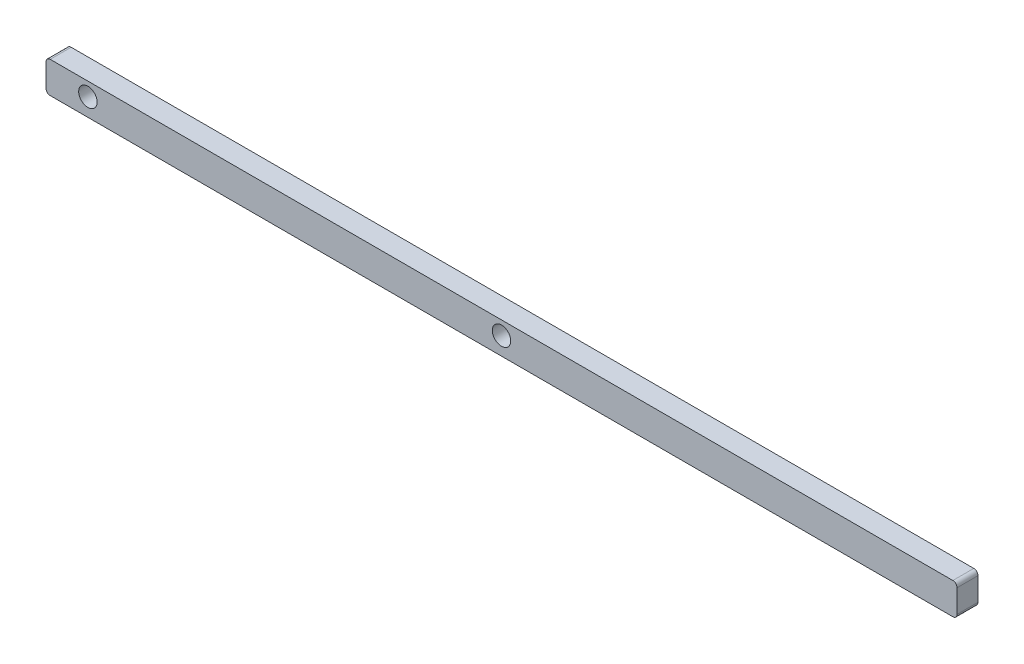
ISO-10303-21;
HEADER;
FILE_DESCRIPTION(('STEP AP214'),'2;1');
FILE_NAME('part.step','',(''),(''),'','','');
FILE_SCHEMA(('AUTOMOTIVE_DESIGN { 1 0 10303 214 1 1 1 1 }'));
ENDSEC;
DATA;
#1=APPLICATION_CONTEXT('core data for automotive mechanical design processes');
#2=APPLICATION_PROTOCOL_DEFINITION('international standard','automotive_design',2000,#1);
#3=PRODUCT_CONTEXT('',#1,'mechanical');
#4=PRODUCT('Part','Part','',(#3));
#5=PRODUCT_RELATED_PRODUCT_CATEGORY('part','',(#4));
#6=PRODUCT_DEFINITION_FORMATION('','',#4);
#7=PRODUCT_DEFINITION_CONTEXT('part definition',#1,'design');
#8=PRODUCT_DEFINITION('design','',#6,#7);
#9=PRODUCT_DEFINITION_SHAPE('','',#8);
#10=(LENGTH_UNIT() NAMED_UNIT(*) SI_UNIT(.MILLI.,.METRE.));
#11=(NAMED_UNIT(*) PLANE_ANGLE_UNIT() SI_UNIT($,.RADIAN.));
#12=(NAMED_UNIT(*) SI_UNIT($,.STERADIAN.) SOLID_ANGLE_UNIT());
#13=UNCERTAINTY_MEASURE_WITH_UNIT(LENGTH_MEASURE(1.E-05),#10,'distance_accuracy_value','');
#14=(GEOMETRIC_REPRESENTATION_CONTEXT(3) GLOBAL_UNCERTAINTY_ASSIGNED_CONTEXT((#13)) GLOBAL_UNIT_ASSIGNED_CONTEXT((#10,
#11,#12)) REPRESENTATION_CONTEXT('',''));
#15=CARTESIAN_POINT('',(0.,0.,0.));
#16=DIRECTION('',(0.,0.,1.));
#17=DIRECTION('',(1.,0.,0.));
#18=AXIS2_PLACEMENT_3D('',#15,#16,#17);
#19=CARTESIAN_POINT('',(0.,0.,6.35));
#20=DIRECTION('',(0.,0.,-1.));
#21=DIRECTION('',(-1.,0.,0.));
#22=AXIS2_PLACEMENT_3D('',#19,#20,#21);
#23=PLANE('',#22);
#24=DIRECTION('',(-1.,0.,0.));
#25=VECTOR('',#24,1.);
#26=CARTESIAN_POINT('',(-276.225,8.26714086578759,6.35));
#27=LINE('',#26,#25);
#28=CARTESIAN_POINT('',(273.685,8.26714086578759,6.35));
#29=VERTEX_POINT('',#28);
#30=CARTESIAN_POINT('',(-273.685,8.26714086578759,6.35));
#31=VERTEX_POINT('',#30);
#32=EDGE_CURVE('E194',#29,#31,#27,.T.);
#33=ORIENTED_EDGE('',*,*,#32,.T.);
#34=CARTESIAN_POINT('',(-273.685,5.72714086578759,6.35));
#35=DIRECTION('',(0.,0.,-1.));
#36=DIRECTION('',(-1.,0.,0.));
#37=AXIS2_PLACEMENT_3D('',#34,#35,#36);
#38=CIRCLE('',#37,2.54);
#39=CARTESIAN_POINT('',(-276.225,5.72714086578758,6.35));
#40=VERTEX_POINT('',#39);
#41=EDGE_CURVE('E170',#31,#40,#38,.F.);
#42=ORIENTED_EDGE('',*,*,#41,.T.);
#43=DIRECTION('',(0.,-1.,0.));
#44=VECTOR('',#43,1.);
#45=CARTESIAN_POINT('',(-276.225,-10.7828591342124,6.35));
#46=LINE('',#45,#44);
#47=CARTESIAN_POINT('',(-276.225,-8.24285913421241,6.35));
#48=VERTEX_POINT('',#47);
#49=EDGE_CURVE('E127',#40,#48,#46,.T.);
#50=ORIENTED_EDGE('',*,*,#49,.T.);
#51=CARTESIAN_POINT('',(-273.685,-8.24285913421241,6.35));
#52=DIRECTION('',(0.,0.,-1.));
#53=DIRECTION('',(-1.,0.,0.));
#54=AXIS2_PLACEMENT_3D('',#51,#52,#53);
#55=CIRCLE('',#54,2.54);
#56=CARTESIAN_POINT('',(-273.685,-10.7828591342124,6.35));
#57=VERTEX_POINT('',#56);
#58=EDGE_CURVE('E62',#48,#57,#55,.F.);
#59=ORIENTED_EDGE('',*,*,#58,.T.);
#60=DIRECTION('',(1.,0.,0.));
#61=VECTOR('',#60,1.);
#62=CARTESIAN_POINT('',(-276.225,-10.7828591342124,6.35));
#63=LINE('',#62,#61);
#64=CARTESIAN_POINT('',(273.685,-10.7828591342124,6.35));
#65=VERTEX_POINT('',#64);
#66=EDGE_CURVE('E148',#57,#65,#63,.T.);
#67=ORIENTED_EDGE('',*,*,#66,.T.);
#68=CARTESIAN_POINT('',(273.685,-8.24285913421241,6.35));
#69=DIRECTION('',(0.,0.,-1.));
#70=DIRECTION('',(-1.,0.,0.));
#71=AXIS2_PLACEMENT_3D('',#68,#69,#70);
#72=CIRCLE('',#71,2.54);
#73=CARTESIAN_POINT('',(276.225,-8.24285913421241,6.35));
#74=VERTEX_POINT('',#73);
#75=EDGE_CURVE('E165',#65,#74,#72,.F.);
#76=ORIENTED_EDGE('',*,*,#75,.T.);
#77=DIRECTION('',(0.,1.,0.));
#78=VECTOR('',#77,1.);
#79=CARTESIAN_POINT('',(276.225,-10.7828591342124,6.35));
#80=LINE('',#79,#78);
#81=CARTESIAN_POINT('',(276.225,5.72714086578758,6.35));
#82=VERTEX_POINT('',#81);
#83=EDGE_CURVE('E141',#74,#82,#80,.T.);
#84=ORIENTED_EDGE('',*,*,#83,.T.);
#85=CARTESIAN_POINT('',(273.685,5.72714086578759,6.35));
#86=DIRECTION('',(0.,0.,-1.));
#87=DIRECTION('',(-1.,0.,0.));
#88=AXIS2_PLACEMENT_3D('',#85,#86,#87);
#89=CIRCLE('',#88,2.54);
#90=EDGE_CURVE('E162',#82,#29,#89,.F.);
#91=ORIENTED_EDGE('',*,*,#90,.T.);
#92=EDGE_LOOP('',(#33,#42,#50,#59,#67,#76,#84,#91));
#93=FACE_BOUND('',#92,.T.);
#94=CARTESIAN_POINT('',(0.,0.,6.35));
#95=DIRECTION('',(0.,0.,1.));
#96=DIRECTION('',(1.,0.,0.));
#97=AXIS2_PLACEMENT_3D('',#94,#95,#96);
#98=CIRCLE('',#97,5.588);
#99=CARTESIAN_POINT('',(5.588,0.,6.35));
#100=VERTEX_POINT('',#99);
#101=EDGE_CURVE('E200',#100,#100,#98,.T.);
#102=ORIENTED_EDGE('',*,*,#101,.F.);
#103=EDGE_LOOP('',(#102));
#104=FACE_BOUND('',#103,.T.);
#105=CARTESIAN_POINT('',(-250.825,0.,6.35));
#106=DIRECTION('',(0.,0.,1.));
#107=DIRECTION('',(1.,0.,0.));
#108=AXIS2_PLACEMENT_3D('',#105,#106,#107);
#109=CIRCLE('',#108,5.58800000000002);
#110=CARTESIAN_POINT('',(-245.237,0.,6.35));
#111=VERTEX_POINT('',#110);
#112=EDGE_CURVE('E214',#111,#111,#109,.T.);
#113=ORIENTED_EDGE('',*,*,#112,.F.);
#114=EDGE_LOOP('',(#113));
#115=FACE_BOUND('',#114,.T.);
#116=ADVANCED_FACE('F39',(#93,#104,#115),#23,.F.);
#117=CARTESIAN_POINT('',(0.,0.,-6.35));
#118=DIRECTION('',(0.,0.,-1.));
#119=DIRECTION('',(-1.,0.,0.));
#120=AXIS2_PLACEMENT_3D('',#117,#118,#119);
#121=PLANE('',#120);
#122=CARTESIAN_POINT('',(0.,0.,-6.35));
#123=DIRECTION('',(0.,0.,1.));
#124=DIRECTION('',(1.,0.,0.));
#125=AXIS2_PLACEMENT_3D('',#122,#123,#124);
#126=CIRCLE('',#125,5.588);
#127=CARTESIAN_POINT('',(5.588,0.,-6.35));
#128=VERTEX_POINT('',#127);
#129=EDGE_CURVE('E203',#128,#128,#126,.T.);
#130=ORIENTED_EDGE('',*,*,#129,.T.);
#131=EDGE_LOOP('',(#130));
#132=FACE_BOUND('',#131,.T.);
#133=DIRECTION('',(0.,-1.,0.));
#134=VECTOR('',#133,1.);
#135=CARTESIAN_POINT('',(-276.225,-10.7828591342124,-6.35));
#136=LINE('',#135,#134);
#137=CARTESIAN_POINT('',(-276.225,5.72714086578758,-6.35));
#138=VERTEX_POINT('',#137);
#139=CARTESIAN_POINT('',(-276.225,-8.24285913421241,-6.35));
#140=VERTEX_POINT('',#139);
#141=EDGE_CURVE('E125',#138,#140,#136,.T.);
#142=ORIENTED_EDGE('',*,*,#141,.F.);
#143=CARTESIAN_POINT('',(-273.685,5.72714086578759,-6.35));
#144=DIRECTION('',(0.,0.,-1.));
#145=DIRECTION('',(-1.,0.,0.));
#146=AXIS2_PLACEMENT_3D('',#143,#144,#145);
#147=CIRCLE('',#146,2.54);
#148=CARTESIAN_POINT('',(-273.685,8.26714086578759,-6.35));
#149=VERTEX_POINT('',#148);
#150=EDGE_CURVE('E107',#138,#149,#147,.T.);
#151=ORIENTED_EDGE('',*,*,#150,.T.);
#152=DIRECTION('',(-1.,0.,0.));
#153=VECTOR('',#152,1.);
#154=CARTESIAN_POINT('',(-276.225,8.26714086578759,-6.35));
#155=LINE('',#154,#153);
#156=CARTESIAN_POINT('',(273.685,8.26714086578759,-6.35));
#157=VERTEX_POINT('',#156);
#158=EDGE_CURVE('E137',#157,#149,#155,.T.);
#159=ORIENTED_EDGE('',*,*,#158,.F.);
#160=CARTESIAN_POINT('',(273.685,5.72714086578759,-6.35));
#161=DIRECTION('',(0.,0.,-1.));
#162=DIRECTION('',(-1.,0.,0.));
#163=AXIS2_PLACEMENT_3D('',#160,#161,#162);
#164=CIRCLE('',#163,2.54);
#165=CARTESIAN_POINT('',(276.225,5.72714086578758,-6.35));
#166=VERTEX_POINT('',#165);
#167=EDGE_CURVE('E129',#157,#166,#164,.T.);
#168=ORIENTED_EDGE('',*,*,#167,.T.);
#169=DIRECTION('',(0.,1.,0.));
#170=VECTOR('',#169,1.);
#171=CARTESIAN_POINT('',(276.225,-10.7828591342124,-6.35));
#172=LINE('',#171,#170);
#173=CARTESIAN_POINT('',(276.225,-8.24285913421241,-6.35));
#174=VERTEX_POINT('',#173);
#175=EDGE_CURVE('E143',#174,#166,#172,.T.);
#176=ORIENTED_EDGE('',*,*,#175,.F.);
#177=CARTESIAN_POINT('',(273.685,-8.24285913421241,-6.35));
#178=DIRECTION('',(0.,0.,-1.));
#179=DIRECTION('',(-1.,0.,0.));
#180=AXIS2_PLACEMENT_3D('',#177,#178,#179);
#181=CIRCLE('',#180,2.54);
#182=CARTESIAN_POINT('',(273.685,-10.7828591342124,-6.35));
#183=VERTEX_POINT('',#182);
#184=EDGE_CURVE('E152',#174,#183,#181,.T.);
#185=ORIENTED_EDGE('',*,*,#184,.T.);
#186=DIRECTION('',(1.,0.,0.));
#187=VECTOR('',#186,1.);
#188=CARTESIAN_POINT('',(-276.225,-10.7828591342124,-6.35));
#189=LINE('',#188,#187);
#190=CARTESIAN_POINT('',(-273.685,-10.7828591342124,-6.35));
#191=VERTEX_POINT('',#190);
#192=EDGE_CURVE('E136',#191,#183,#189,.T.);
#193=ORIENTED_EDGE('',*,*,#192,.F.);
#194=CARTESIAN_POINT('',(-273.685,-8.24285913421241,-6.35));
#195=DIRECTION('',(0.,0.,-1.));
#196=DIRECTION('',(-1.,0.,0.));
#197=AXIS2_PLACEMENT_3D('',#194,#195,#196);
#198=CIRCLE('',#197,2.54);
#199=EDGE_CURVE('E119',#191,#140,#198,.T.);
#200=ORIENTED_EDGE('',*,*,#199,.T.);
#201=EDGE_LOOP('',(#142,#151,#159,#168,#176,#185,#193,#200));
#202=FACE_BOUND('',#201,.T.);
#203=CARTESIAN_POINT('',(-250.825,0.,-6.35));
#204=DIRECTION('',(0.,0.,1.));
#205=DIRECTION('',(1.,0.,0.));
#206=AXIS2_PLACEMENT_3D('',#203,#204,#205);
#207=CIRCLE('',#206,5.58800000000002);
#208=CARTESIAN_POINT('',(-245.237,0.,-6.35));
#209=VERTEX_POINT('',#208);
#210=EDGE_CURVE('E216',#209,#209,#207,.T.);
#211=ORIENTED_EDGE('',*,*,#210,.T.);
#212=EDGE_LOOP('',(#211));
#213=FACE_BOUND('',#212,.T.);
#214=ADVANCED_FACE('F132',(#132,#202,#213),#121,.T.);
#215=CARTESIAN_POINT('',(276.225,-10.7828591342124,6.35));
#216=DIRECTION('',(-1.,0.,0.));
#217=DIRECTION('',(0.,0.,1.));
#218=AXIS2_PLACEMENT_3D('',#215,#216,#217);
#219=PLANE('',#218);
#220=ORIENTED_EDGE('',*,*,#83,.F.);
#221=DIRECTION('',(0.,0.,-1.));
#222=VECTOR('',#221,1.);
#223=CARTESIAN_POINT('',(276.225,-8.24285913421241,6.35));
#224=LINE('',#223,#222);
#225=EDGE_CURVE('E11',#74,#174,#224,.T.);
#226=ORIENTED_EDGE('',*,*,#225,.T.);
#227=ORIENTED_EDGE('',*,*,#175,.T.);
#228=DIRECTION('',(0.,0.,-1.));
#229=VECTOR('',#228,1.);
#230=CARTESIAN_POINT('',(276.225,5.72714086578759,6.35));
#231=LINE('',#230,#229);
#232=EDGE_CURVE('E48',#166,#82,#231,.F.);
#233=ORIENTED_EDGE('',*,*,#232,.T.);
#234=EDGE_LOOP('',(#220,#226,#227,#233));
#235=FACE_BOUND('',#234,.T.);
#236=ADVANCED_FACE('F184',(#235),#219,.F.);
#237=CARTESIAN_POINT('',(-276.225,8.26714086578759,6.35));
#238=DIRECTION('',(0.,-1.,0.));
#239=DIRECTION('',(0.,0.,-1.));
#240=AXIS2_PLACEMENT_3D('',#237,#238,#239);
#241=PLANE('',#240);
#242=ORIENTED_EDGE('',*,*,#158,.T.);
#243=DIRECTION('',(0.,0.,-1.));
#244=VECTOR('',#243,1.);
#245=CARTESIAN_POINT('',(-273.685,8.26714086578759,6.35));
#246=LINE('',#245,#244);
#247=EDGE_CURVE('E112',#149,#31,#246,.F.);
#248=ORIENTED_EDGE('',*,*,#247,.T.);
#249=ORIENTED_EDGE('',*,*,#32,.F.);
#250=DIRECTION('',(0.,0.,-1.));
#251=VECTOR('',#250,1.);
#252=CARTESIAN_POINT('',(273.685,8.26714086578759,6.35));
#253=LINE('',#252,#251);
#254=EDGE_CURVE('E118',#29,#157,#253,.T.);
#255=ORIENTED_EDGE('',*,*,#254,.T.);
#256=EDGE_LOOP('',(#242,#248,#249,#255));
#257=FACE_BOUND('',#256,.T.);
#258=ADVANCED_FACE('F198',(#257),#241,.F.);
#259=CARTESIAN_POINT('',(-276.225,-10.7828591342124,6.35));
#260=DIRECTION('',(1.,0.,0.));
#261=DIRECTION('',(0.,0.,-1.));
#262=AXIS2_PLACEMENT_3D('',#259,#260,#261);
#263=PLANE('',#262);
#264=ORIENTED_EDGE('',*,*,#49,.F.);
#265=DIRECTION('',(0.,0.,-1.));
#266=VECTOR('',#265,1.);
#267=CARTESIAN_POINT('',(-276.225,5.72714086578759,6.35));
#268=LINE('',#267,#266);
#269=EDGE_CURVE('E111',#40,#138,#268,.T.);
#270=ORIENTED_EDGE('',*,*,#269,.T.);
#271=ORIENTED_EDGE('',*,*,#141,.T.);
#272=DIRECTION('',(0.,0.,-1.));
#273=VECTOR('',#272,1.);
#274=CARTESIAN_POINT('',(-276.225,-8.24285913421241,6.35));
#275=LINE('',#274,#273);
#276=EDGE_CURVE('E130',#140,#48,#275,.F.);
#277=ORIENTED_EDGE('',*,*,#276,.T.);
#278=EDGE_LOOP('',(#264,#270,#271,#277));
#279=FACE_BOUND('',#278,.T.);
#280=ADVANCED_FACE('F124',(#279),#263,.F.);
#281=CARTESIAN_POINT('',(-276.225,-10.7828591342124,6.35));
#282=DIRECTION('',(0.,1.,0.));
#283=DIRECTION('',(0.,0.,1.));
#284=AXIS2_PLACEMENT_3D('',#281,#282,#283);
#285=PLANE('',#284);
#286=ORIENTED_EDGE('',*,*,#66,.F.);
#287=DIRECTION('',(0.,0.,-1.));
#288=VECTOR('',#287,1.);
#289=CARTESIAN_POINT('',(-273.685,-10.7828591342124,6.35));
#290=LINE('',#289,#288);
#291=EDGE_CURVE('E175',#57,#191,#290,.T.);
#292=ORIENTED_EDGE('',*,*,#291,.T.);
#293=ORIENTED_EDGE('',*,*,#192,.T.);
#294=DIRECTION('',(0.,0.,-1.));
#295=VECTOR('',#294,1.);
#296=CARTESIAN_POINT('',(273.685,-10.7828591342124,6.35));
#297=LINE('',#296,#295);
#298=EDGE_CURVE('E55',#183,#65,#297,.F.);
#299=ORIENTED_EDGE('',*,*,#298,.T.);
#300=EDGE_LOOP('',(#286,#292,#293,#299));
#301=FACE_BOUND('',#300,.T.);
#302=ADVANCED_FACE('F238',(#301),#285,.F.);
#303=CARTESIAN_POINT('',(0.,0.,6.35));
#304=DIRECTION('',(0.,0.,-1.));
#305=DIRECTION('',(-1.,0.,0.));
#306=AXIS2_PLACEMENT_3D('',#303,#304,#305);
#307=CYLINDRICAL_SURFACE('',#306,5.588);
#308=ORIENTED_EDGE('',*,*,#101,.T.);
#309=EDGE_LOOP('',(#308));
#310=FACE_BOUND('',#309,.T.);
#311=ORIENTED_EDGE('',*,*,#129,.F.);
#312=EDGE_LOOP('',(#311));
#313=FACE_BOUND('',#312,.T.);
#314=ADVANCED_FACE('F235',(#310,#313),#307,.F.);
#315=CARTESIAN_POINT('',(-250.825,0.,6.35));
#316=DIRECTION('',(0.,0.,-1.));
#317=DIRECTION('',(-1.,0.,0.));
#318=AXIS2_PLACEMENT_3D('',#315,#316,#317);
#319=CYLINDRICAL_SURFACE('',#318,5.58800000000002);
#320=ORIENTED_EDGE('',*,*,#112,.T.);
#321=EDGE_LOOP('',(#320));
#322=FACE_BOUND('',#321,.T.);
#323=ORIENTED_EDGE('',*,*,#210,.F.);
#324=EDGE_LOOP('',(#323));
#325=FACE_BOUND('',#324,.T.);
#326=ADVANCED_FACE('F224',(#322,#325),#319,.F.);
#327=CARTESIAN_POINT('',(-273.685,5.72714086578759,6.35));
#328=DIRECTION('',(0.,0.,-1.));
#329=DIRECTION('',(-1.,0.,0.));
#330=AXIS2_PLACEMENT_3D('',#327,#328,#329);
#331=CYLINDRICAL_SURFACE('',#330,2.54);
#332=ORIENTED_EDGE('',*,*,#41,.F.);
#333=ORIENTED_EDGE('',*,*,#247,.F.);
#334=ORIENTED_EDGE('',*,*,#150,.F.);
#335=ORIENTED_EDGE('',*,*,#269,.F.);
#336=EDGE_LOOP('',(#332,#333,#334,#335));
#337=FACE_BOUND('',#336,.T.);
#338=ADVANCED_FACE('F110',(#337),#331,.T.);
#339=CARTESIAN_POINT('',(-273.685,-8.24285913421241,6.35));
#340=DIRECTION('',(0.,0.,-1.));
#341=DIRECTION('',(-1.,0.,0.));
#342=AXIS2_PLACEMENT_3D('',#339,#340,#341);
#343=CYLINDRICAL_SURFACE('',#342,2.54);
#344=ORIENTED_EDGE('',*,*,#58,.F.);
#345=ORIENTED_EDGE('',*,*,#276,.F.);
#346=ORIENTED_EDGE('',*,*,#199,.F.);
#347=ORIENTED_EDGE('',*,*,#291,.F.);
#348=EDGE_LOOP('',(#344,#345,#346,#347));
#349=FACE_BOUND('',#348,.T.);
#350=ADVANCED_FACE('F249',(#349),#343,.T.);
#351=CARTESIAN_POINT('',(273.685,-8.24285913421241,6.35));
#352=DIRECTION('',(0.,0.,-1.));
#353=DIRECTION('',(-1.,0.,0.));
#354=AXIS2_PLACEMENT_3D('',#351,#352,#353);
#355=CYLINDRICAL_SURFACE('',#354,2.54);
#356=ORIENTED_EDGE('',*,*,#75,.F.);
#357=ORIENTED_EDGE('',*,*,#298,.F.);
#358=ORIENTED_EDGE('',*,*,#184,.F.);
#359=ORIENTED_EDGE('',*,*,#225,.F.);
#360=EDGE_LOOP('',(#356,#357,#358,#359));
#361=FACE_BOUND('',#360,.T.);
#362=ADVANCED_FACE('F251',(#361),#355,.T.);
#363=CARTESIAN_POINT('',(273.685,5.72714086578759,6.35));
#364=DIRECTION('',(0.,0.,-1.));
#365=DIRECTION('',(-1.,0.,0.));
#366=AXIS2_PLACEMENT_3D('',#363,#364,#365);
#367=CYLINDRICAL_SURFACE('',#366,2.54);
#368=ORIENTED_EDGE('',*,*,#90,.F.);
#369=ORIENTED_EDGE('',*,*,#232,.F.);
#370=ORIENTED_EDGE('',*,*,#167,.F.);
#371=ORIENTED_EDGE('',*,*,#254,.F.);
#372=EDGE_LOOP('',(#368,#369,#370,#371));
#373=FACE_BOUND('',#372,.T.);
#374=ADVANCED_FACE('F41',(#373),#367,.T.);
#375=CLOSED_SHELL('',(#116,#214,#236,#258,#280,#302,#314,#326,#338,#350,#362,#374));
#376=MANIFOLD_SOLID_BREP('B2',#375);
#377=ADVANCED_BREP_SHAPE_REPRESENTATION('',(#18,#376),#14);
#378=SHAPE_DEFINITION_REPRESENTATION(#9,#377);
ENDSEC;
END-ISO-10303-21;
